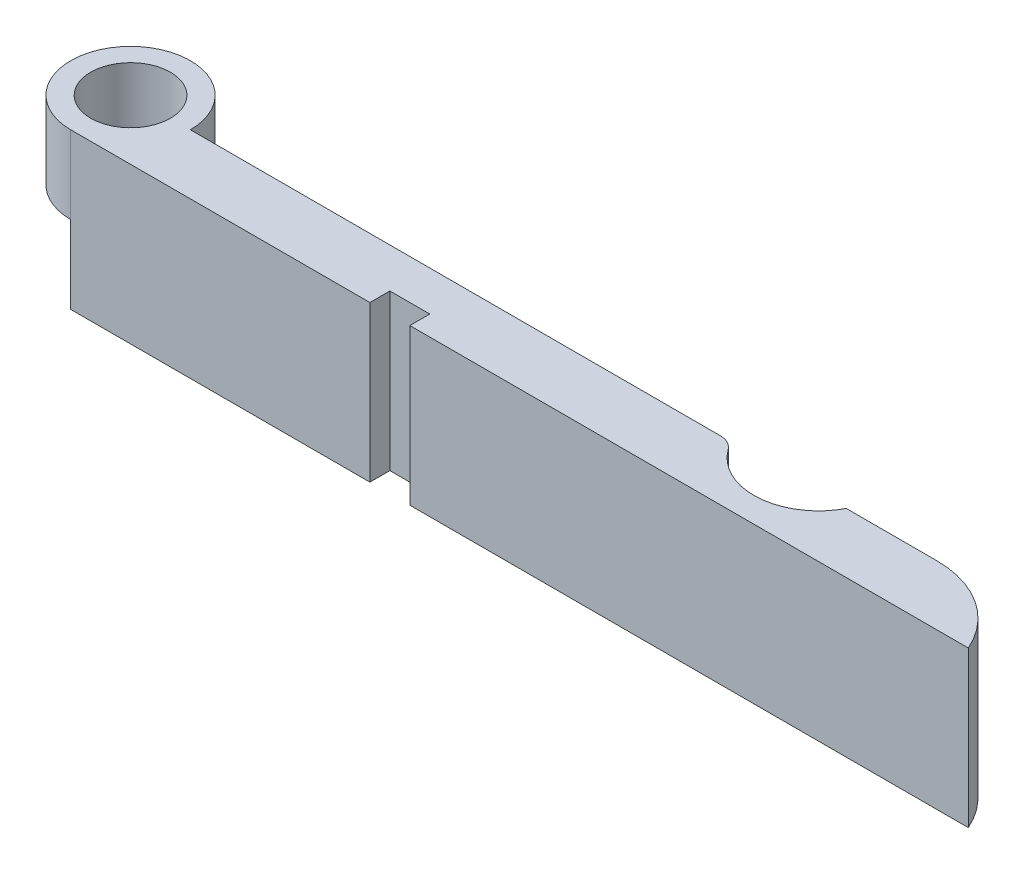
ISO-10303-21;
HEADER;
FILE_DESCRIPTION(('STEP AP214'),'2;1');
FILE_NAME('part.step','',(''),(''),'','','');
FILE_SCHEMA(('AUTOMOTIVE_DESIGN { 1 0 10303 214 1 1 1 1 }'));
ENDSEC;
DATA;
#1=APPLICATION_CONTEXT('core data for automotive mechanical design processes');
#2=APPLICATION_PROTOCOL_DEFINITION('international standard','automotive_design',2000,#1);
#3=PRODUCT_CONTEXT('',#1,'mechanical');
#4=PRODUCT('Part','Part','',(#3));
#5=PRODUCT_RELATED_PRODUCT_CATEGORY('part','',(#4));
#6=PRODUCT_DEFINITION_FORMATION('','',#4);
#7=PRODUCT_DEFINITION_CONTEXT('part definition',#1,'design');
#8=PRODUCT_DEFINITION('design','',#6,#7);
#9=PRODUCT_DEFINITION_SHAPE('','',#8);
#10=(LENGTH_UNIT() NAMED_UNIT(*) SI_UNIT(.MILLI.,.METRE.));
#11=(NAMED_UNIT(*) PLANE_ANGLE_UNIT() SI_UNIT($,.RADIAN.));
#12=(NAMED_UNIT(*) SI_UNIT($,.STERADIAN.) SOLID_ANGLE_UNIT());
#13=UNCERTAINTY_MEASURE_WITH_UNIT(LENGTH_MEASURE(1.E-05),#10,'distance_accuracy_value','');
#14=(GEOMETRIC_REPRESENTATION_CONTEXT(3) GLOBAL_UNCERTAINTY_ASSIGNED_CONTEXT((#13)) GLOBAL_UNIT_ASSIGNED_CONTEXT((#10,
#11,#12)) REPRESENTATION_CONTEXT('',''));
#15=CARTESIAN_POINT('',(0.,0.,0.));
#16=DIRECTION('',(0.,0.,1.));
#17=DIRECTION('',(1.,0.,0.));
#18=AXIS2_PLACEMENT_3D('',#15,#16,#17);
#19=CARTESIAN_POINT('',(0.,3.9,0.));
#20=DIRECTION('',(0.,0.,1.));
#21=DIRECTION('',(1.,0.,0.));
#22=AXIS2_PLACEMENT_3D('',#19,#20,#21);
#23=PLANE('',#22);
#24=DIRECTION('',(-1.,0.,0.));
#25=VECTOR('',#24,1.);
#26=CARTESIAN_POINT('',(0.,3.9,0.));
#27=LINE('',#26,#25);
#28=CARTESIAN_POINT('',(29.5630682287831,3.9,0.));
#29=VERTEX_POINT('',#28);
#30=CARTESIAN_POINT('',(3.,3.9,0.));
#31=VERTEX_POINT('',#30);
#32=EDGE_CURVE('E145',#29,#31,#27,.T.);
#33=ORIENTED_EDGE('',*,*,#32,.F.);
#34=DIRECTION('',(0.,-1.,0.));
#35=VECTOR('',#34,1.);
#36=CARTESIAN_POINT('',(29.5630682287831,3.9,0.));
#37=LINE('',#36,#35);
#38=CARTESIAN_POINT('',(29.5630682287831,-3.9,0.));
#39=VERTEX_POINT('',#38);
#40=EDGE_CURVE('E185',#29,#39,#37,.T.);
#41=ORIENTED_EDGE('',*,*,#40,.T.);
#42=DIRECTION('',(-1.,0.,0.));
#43=VECTOR('',#42,1.);
#44=CARTESIAN_POINT('',(0.,-3.9,0.));
#45=LINE('',#44,#43);
#46=CARTESIAN_POINT('',(3.,-3.9,0.));
#47=VERTEX_POINT('',#46);
#48=EDGE_CURVE('E192',#39,#47,#45,.T.);
#49=ORIENTED_EDGE('',*,*,#48,.T.);
#50=DIRECTION('',(0.,-1.,0.));
#51=VECTOR('',#50,1.);
#52=CARTESIAN_POINT('',(3.,3.9,0.));
#53=LINE('',#52,#51);
#54=CARTESIAN_POINT('',(3.,0.,0.));
#55=VERTEX_POINT('',#54);
#56=EDGE_CURVE('E159',#55,#47,#53,.T.);
#57=ORIENTED_EDGE('',*,*,#56,.F.);
#58=EDGE_CURVE('E155',#31,#55,#53,.T.);
#59=ORIENTED_EDGE('',*,*,#58,.F.);
#60=EDGE_LOOP('',(#33,#41,#49,#57,#59));
#61=FACE_BOUND('',#60,.T.);
#62=ADVANCED_FACE('F35',(#61),#23,.F.);
#63=CARTESIAN_POINT('',(0.,3.9,3.));
#64=DIRECTION('',(0.,0.,-1.));
#65=DIRECTION('',(-1.,0.,0.));
#66=AXIS2_PLACEMENT_3D('',#63,#64,#65);
#67=PLANE('',#66);
#68=DIRECTION('',(1.,0.,0.));
#69=VECTOR('',#68,1.);
#70=CARTESIAN_POINT('',(0.,3.9,3.));
#71=LINE('',#70,#69);
#72=CARTESIAN_POINT('',(17.,3.9,3.));
#73=VERTEX_POINT('',#72);
#74=CARTESIAN_POINT('',(45.,3.9,3.));
#75=VERTEX_POINT('',#74);
#76=EDGE_CURVE('E144',#73,#75,#71,.T.);
#77=ORIENTED_EDGE('',*,*,#76,.F.);
#78=DIRECTION('',(0.,-1.,0.));
#79=VECTOR('',#78,1.);
#80=CARTESIAN_POINT('',(17.,3.9,3.));
#81=LINE('',#80,#79);
#82=CARTESIAN_POINT('',(17.,-3.9,3.));
#83=VERTEX_POINT('',#82);
#84=EDGE_CURVE('E200',#73,#83,#81,.T.);
#85=ORIENTED_EDGE('',*,*,#84,.T.);
#86=DIRECTION('',(1.,0.,0.));
#87=VECTOR('',#86,1.);
#88=CARTESIAN_POINT('',(0.,-3.9,3.));
#89=LINE('',#88,#87);
#90=CARTESIAN_POINT('',(45.,-3.9,3.));
#91=VERTEX_POINT('',#90);
#92=EDGE_CURVE('E202',#83,#91,#89,.T.);
#93=ORIENTED_EDGE('',*,*,#92,.T.);
#94=DIRECTION('',(0.,-1.,0.));
#95=VECTOR('',#94,1.);
#96=CARTESIAN_POINT('',(45.,3.9,3.));
#97=LINE('',#96,#95);
#98=EDGE_CURVE('E154',#75,#91,#97,.T.);
#99=ORIENTED_EDGE('',*,*,#98,.F.);
#100=EDGE_LOOP('',(#77,#85,#93,#99));
#101=FACE_BOUND('',#100,.T.);
#102=ADVANCED_FACE('F215',(#101),#67,.F.);
#103=CARTESIAN_POINT('',(0.,3.9,0.));
#104=DIRECTION('',(0.,-1.,0.));
#105=DIRECTION('',(0.,0.,-1.));
#106=AXIS2_PLACEMENT_3D('',#103,#104,#105);
#107=CYLINDRICAL_SURFACE('',#106,3.);
#108=ORIENTED_EDGE('',*,*,#58,.T.);
#109=CARTESIAN_POINT('',(0.,0.,0.));
#110=DIRECTION('',(0.,1.,0.));
#111=DIRECTION('',(0.,0.,1.));
#112=AXIS2_PLACEMENT_3D('',#109,#110,#111);
#113=CIRCLE('',#112,3.);
#114=CARTESIAN_POINT('',(0.,0.,3.));
#115=VERTEX_POINT('',#114);
#116=EDGE_CURVE('E169',#55,#115,#113,.T.);
#117=ORIENTED_EDGE('',*,*,#116,.T.);
#118=DIRECTION('',(0.,-1.,0.));
#119=VECTOR('',#118,1.);
#120=CARTESIAN_POINT('',(0.,3.9,3.));
#121=LINE('',#120,#119);
#122=CARTESIAN_POINT('',(0.,3.9,3.));
#123=VERTEX_POINT('',#122);
#124=EDGE_CURVE('E160',#123,#115,#121,.T.);
#125=ORIENTED_EDGE('',*,*,#124,.F.);
#126=CARTESIAN_POINT('',(0.,3.9,0.));
#127=DIRECTION('',(0.,1.,0.));
#128=DIRECTION('',(0.,0.,1.));
#129=AXIS2_PLACEMENT_3D('',#126,#127,#128);
#130=CIRCLE('',#129,3.);
#131=EDGE_CURVE('E172',#31,#123,#130,.T.);
#132=ORIENTED_EDGE('',*,*,#131,.F.);
#133=EDGE_LOOP('',(#108,#117,#125,#132));
#134=FACE_BOUND('',#133,.T.);
#135=ADVANCED_FACE('F240',(#134),#107,.T.);
#136=CARTESIAN_POINT('',(0.,3.9,0.));
#137=DIRECTION('',(0.,1.,0.));
#138=DIRECTION('',(0.,0.,1.));
#139=AXIS2_PLACEMENT_3D('',#136,#137,#138);
#140=PLANE('',#139);
#141=CARTESIAN_POINT('',(33.,3.9,-1.5));
#142=DIRECTION('',(0.,-1.,0.));
#143=DIRECTION('',(0.,0.,-1.));
#144=AXIS2_PLACEMENT_3D('',#141,#142,#143);
#145=CIRCLE('',#144,3.25);
#146=CARTESIAN_POINT('',(35.8831406486677,3.9,0.));
#147=VERTEX_POINT('',#146);
#148=CARTESIAN_POINT('',(30.3717580573047,3.9,0.411764705882352));
#149=VERTEX_POINT('',#148);
#150=EDGE_CURVE('E120',#147,#149,#145,.T.);
#151=ORIENTED_EDGE('',*,*,#150,.T.);
#152=CARTESIAN_POINT('',(29.5630682287831,3.9,0.999999999999998));
#153=DIRECTION('',(0.,1.,0.));
#154=DIRECTION('',(0.,0.,1.));
#155=AXIS2_PLACEMENT_3D('',#152,#153,#154);
#156=CIRCLE('',#155,1.);
#157=EDGE_CURVE('E11',#149,#29,#156,.T.);
#158=ORIENTED_EDGE('',*,*,#157,.T.);
#159=ORIENTED_EDGE('',*,*,#32,.T.);
#160=ORIENTED_EDGE('',*,*,#131,.T.);
#161=CARTESIAN_POINT('',(15.,3.9,3.));
#162=VERTEX_POINT('',#161);
#163=EDGE_CURVE('E147',#123,#162,#71,.T.);
#164=ORIENTED_EDGE('',*,*,#163,.T.);
#165=DIRECTION('',(0.,0.,-1.));
#166=VECTOR('',#165,1.);
#167=CARTESIAN_POINT('',(15.,3.9,4.));
#168=LINE('',#167,#166);
#169=CARTESIAN_POINT('',(15.,3.9,2.));
#170=VERTEX_POINT('',#169);
#171=EDGE_CURVE('E280',#162,#170,#168,.T.);
#172=ORIENTED_EDGE('',*,*,#171,.T.);
#173=DIRECTION('',(1.,0.,0.));
#174=VECTOR('',#173,1.);
#175=CARTESIAN_POINT('',(15.,3.9,2.));
#176=LINE('',#175,#174);
#177=CARTESIAN_POINT('',(17.,3.9,2.));
#178=VERTEX_POINT('',#177);
#179=EDGE_CURVE('E283',#170,#178,#176,.T.);
#180=ORIENTED_EDGE('',*,*,#179,.T.);
#181=DIRECTION('',(0.,0.,1.));
#182=VECTOR('',#181,1.);
#183=CARTESIAN_POINT('',(17.,3.9,4.));
#184=LINE('',#183,#182);
#185=EDGE_CURVE('E284',#178,#73,#184,.T.);
#186=ORIENTED_EDGE('',*,*,#185,.T.);
#187=ORIENTED_EDGE('',*,*,#76,.T.);
#188=CARTESIAN_POINT('',(40.4174243050442,3.9,5.));
#189=DIRECTION('',(0.,1.,0.));
#190=DIRECTION('',(0.,0.,1.));
#191=AXIS2_PLACEMENT_3D('',#188,#189,#190);
#192=CIRCLE('',#191,5.);
#193=CARTESIAN_POINT('',(40.4174243050442,3.9,0.));
#194=VERTEX_POINT('',#193);
#195=EDGE_CURVE('E143',#75,#194,#192,.T.);
#196=ORIENTED_EDGE('',*,*,#195,.T.);
#197=EDGE_CURVE('E134',#194,#147,#27,.T.);
#198=ORIENTED_EDGE('',*,*,#197,.T.);
#199=EDGE_LOOP('',(#151,#158,#159,#160,#164,#172,#180,#186,#187,#196,#198));
#200=FACE_BOUND('',#199,.T.);
#201=CARTESIAN_POINT('',(0.,3.9,0.));
#202=DIRECTION('',(0.,1.,0.));
#203=DIRECTION('',(0.,0.,1.));
#204=AXIS2_PLACEMENT_3D('',#201,#202,#203);
#205=CIRCLE('',#204,2.);
#206=CARTESIAN_POINT('',(0.,3.9,2.));
#207=VERTEX_POINT('',#206);
#208=EDGE_CURVE('E166',#207,#207,#205,.T.);
#209=ORIENTED_EDGE('',*,*,#208,.F.);
#210=EDGE_LOOP('',(#209));
#211=FACE_BOUND('',#210,.T.);
#212=ADVANCED_FACE('F140',(#200,#211),#140,.T.);
#213=CARTESIAN_POINT('',(0.,0.,0.));
#214=DIRECTION('',(0.,1.,0.));
#215=DIRECTION('',(0.,0.,1.));
#216=AXIS2_PLACEMENT_3D('',#213,#214,#215);
#217=PLANE('',#216);
#218=EDGE_CURVE('E176',#115,#55,#113,.T.);
#219=ORIENTED_EDGE('',*,*,#218,.F.);
#220=ORIENTED_EDGE('',*,*,#116,.F.);
#221=EDGE_LOOP('',(#219,#220));
#222=FACE_BOUND('',#221,.T.);
#223=CARTESIAN_POINT('',(0.,0.,0.));
#224=DIRECTION('',(0.,1.,0.));
#225=DIRECTION('',(0.,0.,1.));
#226=AXIS2_PLACEMENT_3D('',#223,#224,#225);
#227=CIRCLE('',#226,2.);
#228=CARTESIAN_POINT('',(0.,0.,2.));
#229=VERTEX_POINT('',#228);
#230=EDGE_CURVE('E158',#229,#229,#227,.T.);
#231=ORIENTED_EDGE('',*,*,#230,.T.);
#232=EDGE_LOOP('',(#231));
#233=FACE_BOUND('',#232,.T.);
#234=ADVANCED_FACE('F255',(#222,#233),#217,.F.);
#235=CARTESIAN_POINT('',(0.,3.9,0.));
#236=DIRECTION('',(0.,-1.,0.));
#237=DIRECTION('',(0.,0.,-1.));
#238=AXIS2_PLACEMENT_3D('',#235,#236,#237);
#239=CYLINDRICAL_SURFACE('',#238,2.);
#240=ORIENTED_EDGE('',*,*,#208,.T.);
#241=EDGE_LOOP('',(#240));
#242=FACE_BOUND('',#241,.T.);
#243=ORIENTED_EDGE('',*,*,#230,.F.);
#244=EDGE_LOOP('',(#243));
#245=FACE_BOUND('',#244,.T.);
#246=ADVANCED_FACE('F249',(#242,#245),#239,.F.);
#247=CARTESIAN_POINT('',(0.,3.9,0.));
#248=DIRECTION('',(0.,-1.,0.));
#249=DIRECTION('',(0.,0.,-1.));
#250=AXIS2_PLACEMENT_3D('',#247,#248,#249);
#251=CYLINDRICAL_SURFACE('',#250,3.);
#252=CARTESIAN_POINT('',(0.,-3.9,3.));
#253=VERTEX_POINT('',#252);
#254=EDGE_CURVE('E163',#115,#253,#121,.T.);
#255=ORIENTED_EDGE('',*,*,#254,.F.);
#256=ORIENTED_EDGE('',*,*,#218,.T.);
#257=ORIENTED_EDGE('',*,*,#56,.T.);
#258=CARTESIAN_POINT('',(0.,-3.9,0.));
#259=DIRECTION('',(0.,-1.,0.));
#260=DIRECTION('',(0.,0.,-1.));
#261=AXIS2_PLACEMENT_3D('',#258,#259,#260);
#262=CIRCLE('',#261,3.);
#263=EDGE_CURVE('E149',#47,#253,#262,.T.);
#264=ORIENTED_EDGE('',*,*,#263,.T.);
#265=EDGE_LOOP('',(#255,#256,#257,#264));
#266=FACE_BOUND('',#265,.T.);
#267=ADVANCED_FACE('F243',(#266),#251,.F.);
#268=CARTESIAN_POINT('',(40.4174243050442,-3.9,0.));
#269=VERTEX_POINT('',#268);
#270=CARTESIAN_POINT('',(35.8831406486677,-3.9,0.));
#271=VERTEX_POINT('',#270);
#272=EDGE_CURVE('E137',#269,#271,#45,.T.);
#273=ORIENTED_EDGE('',*,*,#272,.T.);
#274=DIRECTION('',(0.,-1.,0.));
#275=VECTOR('',#274,1.);
#276=CARTESIAN_POINT('',(35.8831406486677,3.9,0.));
#277=LINE('',#276,#275);
#278=EDGE_CURVE('E123',#271,#147,#277,.F.);
#279=ORIENTED_EDGE('',*,*,#278,.T.);
#280=ORIENTED_EDGE('',*,*,#197,.F.);
#281=DIRECTION('',(0.,-1.,0.));
#282=VECTOR('',#281,1.);
#283=CARTESIAN_POINT('',(40.4174243050442,3.9,0.));
#284=LINE('',#283,#282);
#285=EDGE_CURVE('E175',#194,#269,#284,.T.);
#286=ORIENTED_EDGE('',*,*,#285,.T.);
#287=EDGE_LOOP('',(#273,#279,#280,#286));
#288=FACE_BOUND('',#287,.T.);
#289=ADVANCED_FACE('F132',(#288),#23,.F.);
#290=CARTESIAN_POINT('',(15.,-3.9,3.));
#291=VERTEX_POINT('',#290);
#292=EDGE_CURVE('E207',#253,#291,#89,.T.);
#293=ORIENTED_EDGE('',*,*,#292,.T.);
#294=DIRECTION('',(0.,1.,0.));
#295=VECTOR('',#294,1.);
#296=CARTESIAN_POINT('',(15.,3.9,3.));
#297=LINE('',#296,#295);
#298=EDGE_CURVE('E204',#291,#162,#297,.T.);
#299=ORIENTED_EDGE('',*,*,#298,.T.);
#300=ORIENTED_EDGE('',*,*,#163,.F.);
#301=ORIENTED_EDGE('',*,*,#124,.T.);
#302=ORIENTED_EDGE('',*,*,#254,.T.);
#303=EDGE_LOOP('',(#293,#299,#300,#301,#302));
#304=FACE_BOUND('',#303,.T.);
#305=ADVANCED_FACE('F230',(#304),#67,.F.);
#306=CARTESIAN_POINT('',(0.,-3.9,0.));
#307=DIRECTION('',(0.,-1.,0.));
#308=DIRECTION('',(0.,0.,-1.));
#309=AXIS2_PLACEMENT_3D('',#306,#307,#308);
#310=PLANE('',#309);
#311=ORIENTED_EDGE('',*,*,#48,.F.);
#312=CARTESIAN_POINT('',(29.5630682287831,-3.9,0.999999999999998));
#313=DIRECTION('',(0.,-1.,0.));
#314=DIRECTION('',(0.,0.,-1.));
#315=AXIS2_PLACEMENT_3D('',#312,#313,#314);
#316=CIRCLE('',#315,1.);
#317=CARTESIAN_POINT('',(30.3717580573047,-3.9,0.411764705882352));
#318=VERTEX_POINT('',#317);
#319=EDGE_CURVE('E57',#39,#318,#316,.T.);
#320=ORIENTED_EDGE('',*,*,#319,.T.);
#321=CARTESIAN_POINT('',(33.,-3.9,-1.5));
#322=DIRECTION('',(0.,-1.,0.));
#323=DIRECTION('',(0.,0.,-1.));
#324=AXIS2_PLACEMENT_3D('',#321,#322,#323);
#325=CIRCLE('',#324,3.25);
#326=EDGE_CURVE('E127',#271,#318,#325,.T.);
#327=ORIENTED_EDGE('',*,*,#326,.F.);
#328=ORIENTED_EDGE('',*,*,#272,.F.);
#329=CARTESIAN_POINT('',(40.4174243050442,-3.9,5.));
#330=DIRECTION('',(0.,-1.,0.));
#331=DIRECTION('',(0.,0.,-1.));
#332=AXIS2_PLACEMENT_3D('',#329,#330,#331);
#333=CIRCLE('',#332,5.);
#334=EDGE_CURVE('E179',#269,#91,#333,.T.);
#335=ORIENTED_EDGE('',*,*,#334,.T.);
#336=ORIENTED_EDGE('',*,*,#92,.F.);
#337=DIRECTION('',(0.,0.,1.));
#338=VECTOR('',#337,1.);
#339=CARTESIAN_POINT('',(17.,-3.9,4.));
#340=LINE('',#339,#338);
#341=CARTESIAN_POINT('',(17.,-3.9,2.));
#342=VERTEX_POINT('',#341);
#343=EDGE_CURVE('E138',#342,#83,#340,.T.);
#344=ORIENTED_EDGE('',*,*,#343,.F.);
#345=DIRECTION('',(1.,0.,0.));
#346=VECTOR('',#345,1.);
#347=CARTESIAN_POINT('',(15.,-3.9,2.));
#348=LINE('',#347,#346);
#349=CARTESIAN_POINT('',(15.,-3.9,2.));
#350=VERTEX_POINT('',#349);
#351=EDGE_CURVE('E288',#350,#342,#348,.T.);
#352=ORIENTED_EDGE('',*,*,#351,.F.);
#353=DIRECTION('',(0.,0.,-1.));
#354=VECTOR('',#353,1.);
#355=CARTESIAN_POINT('',(15.,-3.9,0.));
#356=LINE('',#355,#354);
#357=EDGE_CURVE('E183',#291,#350,#356,.T.);
#358=ORIENTED_EDGE('',*,*,#357,.F.);
#359=ORIENTED_EDGE('',*,*,#292,.F.);
#360=ORIENTED_EDGE('',*,*,#263,.F.);
#361=EDGE_LOOP('',(#311,#320,#327,#328,#335,#336,#344,#352,#358,#359,#360));
#362=FACE_BOUND('',#361,.T.);
#363=ADVANCED_FACE('F197',(#362),#310,.T.);
#364=CARTESIAN_POINT('',(40.4174243050442,3.9,5.));
#365=DIRECTION('',(0.,-1.,0.));
#366=DIRECTION('',(0.,0.,-1.));
#367=AXIS2_PLACEMENT_3D('',#364,#365,#366);
#368=CYLINDRICAL_SURFACE('',#367,5.);
#369=ORIENTED_EDGE('',*,*,#195,.F.);
#370=ORIENTED_EDGE('',*,*,#98,.T.);
#371=ORIENTED_EDGE('',*,*,#334,.F.);
#372=ORIENTED_EDGE('',*,*,#285,.F.);
#373=EDGE_LOOP('',(#369,#370,#371,#372));
#374=FACE_BOUND('',#373,.T.);
#375=ADVANCED_FACE('F218',(#374),#368,.T.);
#376=CARTESIAN_POINT('',(17.,3.9,4.));
#377=DIRECTION('',(1.,0.,0.));
#378=DIRECTION('',(0.,0.,-1.));
#379=AXIS2_PLACEMENT_3D('',#376,#377,#378);
#380=PLANE('',#379);
#381=ORIENTED_EDGE('',*,*,#185,.F.);
#382=DIRECTION('',(0.,-1.,0.));
#383=VECTOR('',#382,1.);
#384=CARTESIAN_POINT('',(17.,3.9,2.));
#385=LINE('',#384,#383);
#386=EDGE_CURVE('E294',#178,#342,#385,.T.);
#387=ORIENTED_EDGE('',*,*,#386,.T.);
#388=ORIENTED_EDGE('',*,*,#343,.T.);
#389=ORIENTED_EDGE('',*,*,#84,.F.);
#390=EDGE_LOOP('',(#381,#387,#388,#389));
#391=FACE_BOUND('',#390,.T.);
#392=ADVANCED_FACE('F220',(#391),#380,.F.);
#393=CARTESIAN_POINT('',(15.,3.9,4.));
#394=DIRECTION('',(-1.,0.,0.));
#395=DIRECTION('',(0.,0.,1.));
#396=AXIS2_PLACEMENT_3D('',#393,#394,#395);
#397=PLANE('',#396);
#398=ORIENTED_EDGE('',*,*,#357,.T.);
#399=DIRECTION('',(0.,-1.,0.));
#400=VECTOR('',#399,1.);
#401=CARTESIAN_POINT('',(15.,3.9,2.));
#402=LINE('',#401,#400);
#403=EDGE_CURVE('E286',#170,#350,#402,.T.);
#404=ORIENTED_EDGE('',*,*,#403,.F.);
#405=ORIENTED_EDGE('',*,*,#171,.F.);
#406=ORIENTED_EDGE('',*,*,#298,.F.);
#407=EDGE_LOOP('',(#398,#404,#405,#406));
#408=FACE_BOUND('',#407,.T.);
#409=ADVANCED_FACE('F226',(#408),#397,.F.);
#410=CARTESIAN_POINT('',(15.,3.9,2.));
#411=DIRECTION('',(0.,0.,-1.));
#412=DIRECTION('',(-1.,0.,0.));
#413=AXIS2_PLACEMENT_3D('',#410,#411,#412);
#414=PLANE('',#413);
#415=ORIENTED_EDGE('',*,*,#351,.T.);
#416=ORIENTED_EDGE('',*,*,#386,.F.);
#417=ORIENTED_EDGE('',*,*,#179,.F.);
#418=ORIENTED_EDGE('',*,*,#403,.T.);
#419=EDGE_LOOP('',(#415,#416,#417,#418));
#420=FACE_BOUND('',#419,.T.);
#421=ADVANCED_FACE('F260',(#420),#414,.F.);
#422=CARTESIAN_POINT('',(33.,3.9,-1.5));
#423=DIRECTION('',(0.,-1.,0.));
#424=DIRECTION('',(0.,0.,-1.));
#425=AXIS2_PLACEMENT_3D('',#422,#423,#424);
#426=CYLINDRICAL_SURFACE('',#425,3.25);
#427=ORIENTED_EDGE('',*,*,#326,.T.);
#428=DIRECTION('',(0.,-1.,0.));
#429=VECTOR('',#428,1.);
#430=CARTESIAN_POINT('',(30.3717580573047,3.9,0.411764705882351));
#431=LINE('',#430,#429);
#432=EDGE_CURVE('E43',#318,#149,#431,.F.);
#433=ORIENTED_EDGE('',*,*,#432,.T.);
#434=ORIENTED_EDGE('',*,*,#150,.F.);
#435=ORIENTED_EDGE('',*,*,#278,.F.);
#436=EDGE_LOOP('',(#427,#433,#434,#435));
#437=FACE_BOUND('',#436,.T.);
#438=ADVANCED_FACE('F122',(#437),#426,.F.);
#439=CARTESIAN_POINT('',(29.5630682287831,3.9,0.999999999999998));
#440=DIRECTION('',(0.,-1.,0.));
#441=DIRECTION('',(0.,0.,-1.));
#442=AXIS2_PLACEMENT_3D('',#439,#440,#441);
#443=CYLINDRICAL_SURFACE('',#442,1.);
#444=ORIENTED_EDGE('',*,*,#157,.F.);
#445=ORIENTED_EDGE('',*,*,#432,.F.);
#446=ORIENTED_EDGE('',*,*,#319,.F.);
#447=ORIENTED_EDGE('',*,*,#40,.F.);
#448=EDGE_LOOP('',(#444,#445,#446,#447));
#449=FACE_BOUND('',#448,.T.);
#450=ADVANCED_FACE('F37',(#449),#443,.T.);
#451=CLOSED_SHELL('',(#62,#102,#135,#212,#234,#246,#267,#289,#305,#363,#375,#392,#409,#421,#438,#450));
#452=MANIFOLD_SOLID_BREP('B2',#451);
#453=ADVANCED_BREP_SHAPE_REPRESENTATION('',(#18,#452),#14);
#454=SHAPE_DEFINITION_REPRESENTATION(#9,#453);
ENDSEC;
END-ISO-10303-21;
